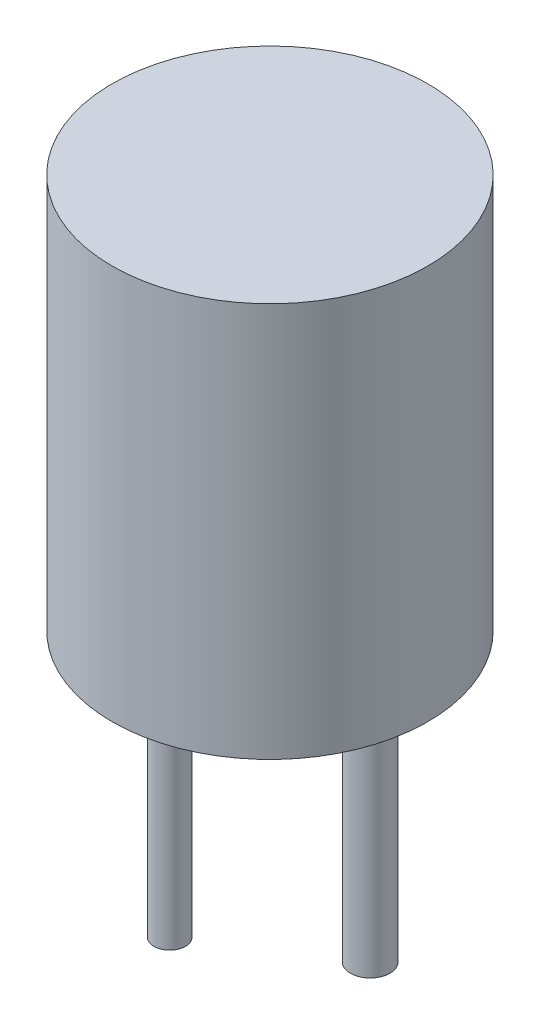
ISO-10303-21;
HEADER;
FILE_DESCRIPTION(('STEP AP214'),'2;1');
FILE_NAME('part.step','',(''),(''),'','','');
FILE_SCHEMA(('AUTOMOTIVE_DESIGN { 1 0 10303 214 1 1 1 1 }'));
ENDSEC;
DATA;
#1=APPLICATION_CONTEXT('core data for automotive mechanical design processes');
#2=APPLICATION_PROTOCOL_DEFINITION('international standard','automotive_design',2000,#1);
#3=PRODUCT_CONTEXT('',#1,'mechanical');
#4=PRODUCT('Part','Part','',(#3));
#5=PRODUCT_RELATED_PRODUCT_CATEGORY('part','',(#4));
#6=PRODUCT_DEFINITION_FORMATION('','',#4);
#7=PRODUCT_DEFINITION_CONTEXT('part definition',#1,'design');
#8=PRODUCT_DEFINITION('design','',#6,#7);
#9=PRODUCT_DEFINITION_SHAPE('','',#8);
#10=(LENGTH_UNIT() NAMED_UNIT(*) SI_UNIT(.MILLI.,.METRE.));
#11=(NAMED_UNIT(*) PLANE_ANGLE_UNIT() SI_UNIT($,.RADIAN.));
#12=(NAMED_UNIT(*) SI_UNIT($,.STERADIAN.) SOLID_ANGLE_UNIT());
#13=UNCERTAINTY_MEASURE_WITH_UNIT(LENGTH_MEASURE(1.E-05),#10,'distance_accuracy_value','');
#14=(GEOMETRIC_REPRESENTATION_CONTEXT(3) GLOBAL_UNCERTAINTY_ASSIGNED_CONTEXT((#13)) GLOBAL_UNIT_ASSIGNED_CONTEXT((#10,
#11,#12)) REPRESENTATION_CONTEXT('',''));
#15=CARTESIAN_POINT('',(0.,0.,0.));
#16=DIRECTION('',(0.,0.,1.));
#17=DIRECTION('',(1.,0.,0.));
#18=AXIS2_PLACEMENT_3D('',#15,#16,#17);
#19=CARTESIAN_POINT('',(0.,0.,0.));
#20=DIRECTION('',(0.,1.,0.));
#21=DIRECTION('',(0.,0.,1.));
#22=AXIS2_PLACEMENT_3D('',#19,#20,#21);
#23=PLANE('',#22);
#24=CARTESIAN_POINT('',(-2.54,0.,0.));
#25=DIRECTION('',(0.,1.,0.));
#26=DIRECTION('',(0.,0.,1.));
#27=AXIS2_PLACEMENT_3D('',#24,#25,#26);
#28=CIRCLE('',#27,0.4);
#29=CARTESIAN_POINT('',(-2.54,0.,0.4));
#30=VERTEX_POINT('',#29);
#31=EDGE_CURVE('E38',#30,#30,#28,.F.);
#32=ORIENTED_EDGE('',*,*,#31,.F.);
#33=EDGE_LOOP('',(#32));
#34=FACE_BOUND('',#33,.T.);
#35=CARTESIAN_POINT('',(0.,0.,0.));
#36=DIRECTION('',(0.,1.,0.));
#37=DIRECTION('',(0.,0.,1.));
#38=AXIS2_PLACEMENT_3D('',#35,#36,#37);
#39=CIRCLE('',#38,4.);
#40=CARTESIAN_POINT('',(0.,0.,4.));
#41=VERTEX_POINT('',#40);
#42=EDGE_CURVE('E46',#41,#41,#39,.T.);
#43=ORIENTED_EDGE('',*,*,#42,.F.);
#44=EDGE_LOOP('',(#43));
#45=FACE_BOUND('',#44,.T.);
#46=CARTESIAN_POINT('',(2.54,0.,0.));
#47=DIRECTION('',(0.,1.,0.));
#48=DIRECTION('',(0.,0.,1.));
#49=AXIS2_PLACEMENT_3D('',#46,#47,#48);
#50=CIRCLE('',#49,0.500000000000001);
#51=CARTESIAN_POINT('',(2.54,0.,0.5));
#52=VERTEX_POINT('',#51);
#53=EDGE_CURVE('E10',#52,#52,#50,.F.);
#54=ORIENTED_EDGE('',*,*,#53,.F.);
#55=EDGE_LOOP('',(#54));
#56=FACE_BOUND('',#55,.T.);
#57=ADVANCED_FACE('F31',(#34,#45,#56),#23,.F.);
#58=CARTESIAN_POINT('',(0.,10.,0.));
#59=DIRECTION('',(0.,-1.,0.));
#60=DIRECTION('',(0.,0.,-1.));
#61=AXIS2_PLACEMENT_3D('',#58,#59,#60);
#62=CYLINDRICAL_SURFACE('',#61,4.);
#63=CARTESIAN_POINT('',(0.,10.,0.));
#64=DIRECTION('',(0.,1.,0.));
#65=DIRECTION('',(0.,0.,1.));
#66=AXIS2_PLACEMENT_3D('',#63,#64,#65);
#67=CIRCLE('',#66,4.);
#68=CARTESIAN_POINT('',(0.,10.,4.));
#69=VERTEX_POINT('',#68);
#70=EDGE_CURVE('E42',#69,#69,#67,.T.);
#71=ORIENTED_EDGE('',*,*,#70,.F.);
#72=EDGE_LOOP('',(#71));
#73=FACE_BOUND('',#72,.T.);
#74=ORIENTED_EDGE('',*,*,#42,.T.);
#75=EDGE_LOOP('',(#74));
#76=FACE_BOUND('',#75,.T.);
#77=ADVANCED_FACE('F33',(#73,#76),#62,.T.);
#78=CARTESIAN_POINT('',(0.,10.,0.));
#79=DIRECTION('',(0.,1.,0.));
#80=DIRECTION('',(0.,0.,1.));
#81=AXIS2_PLACEMENT_3D('',#78,#79,#80);
#82=PLANE('',#81);
#83=ORIENTED_EDGE('',*,*,#70,.T.);
#84=EDGE_LOOP('',(#83));
#85=FACE_BOUND('',#84,.T.);
#86=ADVANCED_FACE('F77',(#85),#82,.T.);
#87=CARTESIAN_POINT('',(-2.54,-8.,0.));
#88=DIRECTION('',(0.,1.,0.));
#89=DIRECTION('',(0.,0.,1.));
#90=AXIS2_PLACEMENT_3D('',#87,#88,#89);
#91=CYLINDRICAL_SURFACE('',#90,0.4);
#92=CARTESIAN_POINT('',(-2.54,-8.,0.));
#93=DIRECTION('',(0.,-1.,0.));
#94=DIRECTION('',(0.,0.,-1.));
#95=AXIS2_PLACEMENT_3D('',#92,#93,#94);
#96=CIRCLE('',#95,0.4);
#97=CARTESIAN_POINT('',(-2.54,-8.,-0.4));
#98=VERTEX_POINT('',#97);
#99=EDGE_CURVE('E50',#98,#98,#96,.T.);
#100=ORIENTED_EDGE('',*,*,#99,.F.);
#101=EDGE_LOOP('',(#100));
#102=FACE_BOUND('',#101,.T.);
#103=ORIENTED_EDGE('',*,*,#31,.T.);
#104=EDGE_LOOP('',(#103));
#105=FACE_BOUND('',#104,.T.);
#106=ADVANCED_FACE('F69',(#102,#105),#91,.T.);
#107=CARTESIAN_POINT('',(-2.54,-8.,0.));
#108=DIRECTION('',(0.,-1.,0.));
#109=DIRECTION('',(0.,0.,-1.));
#110=AXIS2_PLACEMENT_3D('',#107,#108,#109);
#111=PLANE('',#110);
#112=ORIENTED_EDGE('',*,*,#99,.T.);
#113=EDGE_LOOP('',(#112));
#114=FACE_BOUND('',#113,.T.);
#115=ADVANCED_FACE('F62',(#114),#111,.T.);
#116=CARTESIAN_POINT('',(2.54,-6.,0.));
#117=DIRECTION('',(0.,1.,0.));
#118=DIRECTION('',(0.,0.,1.));
#119=AXIS2_PLACEMENT_3D('',#116,#117,#118);
#120=CYLINDRICAL_SURFACE('',#119,0.500000000000001);
#121=CARTESIAN_POINT('',(2.54,-6.,0.));
#122=DIRECTION('',(0.,-1.,0.));
#123=DIRECTION('',(0.,0.,-1.));
#124=AXIS2_PLACEMENT_3D('',#121,#122,#123);
#125=CIRCLE('',#124,0.500000000000001);
#126=CARTESIAN_POINT('',(2.54,-6.,-0.500000000000001));
#127=VERTEX_POINT('',#126);
#128=EDGE_CURVE('E54',#127,#127,#125,.T.);
#129=ORIENTED_EDGE('',*,*,#128,.F.);
#130=EDGE_LOOP('',(#129));
#131=FACE_BOUND('',#130,.T.);
#132=ORIENTED_EDGE('',*,*,#53,.T.);
#133=EDGE_LOOP('',(#132));
#134=FACE_BOUND('',#133,.T.);
#135=ADVANCED_FACE('F60',(#131,#134),#120,.T.);
#136=CARTESIAN_POINT('',(2.54,-6.,0.));
#137=DIRECTION('',(0.,-1.,0.));
#138=DIRECTION('',(0.,0.,-1.));
#139=AXIS2_PLACEMENT_3D('',#136,#137,#138);
#140=PLANE('',#139);
#141=ORIENTED_EDGE('',*,*,#128,.T.);
#142=EDGE_LOOP('',(#141));
#143=FACE_BOUND('',#142,.T.);
#144=ADVANCED_FACE('F58',(#143),#140,.T.);
#145=CLOSED_SHELL('',(#57,#77,#86,#106,#115,#135,#144));
#146=MANIFOLD_SOLID_BREP('B2',#145);
#147=ADVANCED_BREP_SHAPE_REPRESENTATION('',(#18,#146),#14);
#148=SHAPE_DEFINITION_REPRESENTATION(#9,#147);
ENDSEC;
END-ISO-10303-21;
